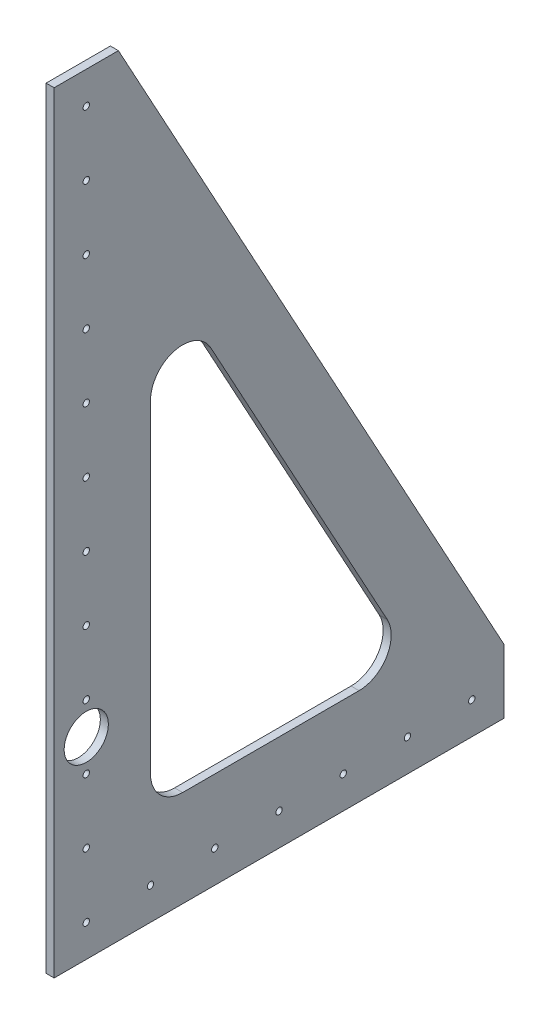
ISO-10303-21;
HEADER;
FILE_DESCRIPTION(('STEP AP214'),'2;1');
FILE_NAME('part.step','',(''),(''),'','','');
FILE_SCHEMA(('AUTOMOTIVE_DESIGN { 1 0 10303 214 1 1 1 1 }'));
ENDSEC;
DATA;
#1=APPLICATION_CONTEXT('core data for automotive mechanical design processes');
#2=APPLICATION_PROTOCOL_DEFINITION('international standard','automotive_design',2000,#1);
#3=PRODUCT_CONTEXT('',#1,'mechanical');
#4=PRODUCT('Part','Part','',(#3));
#5=PRODUCT_RELATED_PRODUCT_CATEGORY('part','',(#4));
#6=PRODUCT_DEFINITION_FORMATION('','',#4);
#7=PRODUCT_DEFINITION_CONTEXT('part definition',#1,'design');
#8=PRODUCT_DEFINITION('design','',#6,#7);
#9=PRODUCT_DEFINITION_SHAPE('','',#8);
#10=(LENGTH_UNIT() NAMED_UNIT(*) SI_UNIT(.MILLI.,.METRE.));
#11=(NAMED_UNIT(*) PLANE_ANGLE_UNIT() SI_UNIT($,.RADIAN.));
#12=(NAMED_UNIT(*) SI_UNIT($,.STERADIAN.) SOLID_ANGLE_UNIT());
#13=UNCERTAINTY_MEASURE_WITH_UNIT(LENGTH_MEASURE(1.E-05),#10,'distance_accuracy_value','');
#14=(GEOMETRIC_REPRESENTATION_CONTEXT(3) GLOBAL_UNCERTAINTY_ASSIGNED_CONTEXT((#13)) GLOBAL_UNIT_ASSIGNED_CONTEXT((#10,
#11,#12)) REPRESENTATION_CONTEXT('',''));
#15=CARTESIAN_POINT('',(0.,0.,0.));
#16=DIRECTION('',(0.,0.,1.));
#17=DIRECTION('',(1.,0.,0.));
#18=AXIS2_PLACEMENT_3D('',#15,#16,#17);
#19=CARTESIAN_POINT('',(6.35,0.,0.));
#20=DIRECTION('',(-1.,0.,0.));
#21=DIRECTION('',(0.,0.,1.));
#22=AXIS2_PLACEMENT_3D('',#19,#20,#21);
#23=PLANE('',#22);
#24=CARTESIAN_POINT('',(6.35,584.2,-25.4));
#25=DIRECTION('',(1.,0.,0.));
#26=DIRECTION('',(0.,0.,-1.));
#27=AXIS2_PLACEMENT_3D('',#24,#25,#26);
#28=CIRCLE('',#27,2.53999999999999);
#29=CARTESIAN_POINT('',(6.35,584.2,-27.94));
#30=VERTEX_POINT('',#29);
#31=EDGE_CURVE('E572',#30,#30,#28,.T.);
#32=ORIENTED_EDGE('',*,*,#31,.F.);
#33=EDGE_LOOP('',(#32));
#34=FACE_BOUND('',#33,.T.);
#35=CARTESIAN_POINT('',(6.35,533.4,-25.4));
#36=DIRECTION('',(1.,0.,0.));
#37=DIRECTION('',(0.,0.,-1.));
#38=AXIS2_PLACEMENT_3D('',#35,#36,#37);
#39=CIRCLE('',#38,2.53999999999999);
#40=CARTESIAN_POINT('',(6.35,533.4,-27.94));
#41=VERTEX_POINT('',#40);
#42=EDGE_CURVE('E576',#41,#41,#39,.T.);
#43=ORIENTED_EDGE('',*,*,#42,.F.);
#44=EDGE_LOOP('',(#43));
#45=FACE_BOUND('',#44,.T.);
#46=CARTESIAN_POINT('',(6.35,482.6,-25.4));
#47=DIRECTION('',(1.,0.,0.));
#48=DIRECTION('',(0.,0.,-1.));
#49=AXIS2_PLACEMENT_3D('',#46,#47,#48);
#50=CIRCLE('',#49,2.54);
#51=CARTESIAN_POINT('',(6.35,482.6,-27.94));
#52=VERTEX_POINT('',#51);
#53=EDGE_CURVE('E687',#52,#52,#50,.T.);
#54=ORIENTED_EDGE('',*,*,#53,.F.);
#55=EDGE_LOOP('',(#54));
#56=FACE_BOUND('',#55,.T.);
#57=CARTESIAN_POINT('',(6.35,431.8,-25.4));
#58=DIRECTION('',(1.,0.,0.));
#59=DIRECTION('',(0.,0.,-1.));
#60=AXIS2_PLACEMENT_3D('',#57,#58,#59);
#61=CIRCLE('',#60,2.54);
#62=CARTESIAN_POINT('',(6.35,431.8,-27.94));
#63=VERTEX_POINT('',#62);
#64=EDGE_CURVE('E679',#63,#63,#61,.T.);
#65=ORIENTED_EDGE('',*,*,#64,.F.);
#66=EDGE_LOOP('',(#65));
#67=FACE_BOUND('',#66,.T.);
#68=CARTESIAN_POINT('',(6.35,381.,-25.4));
#69=DIRECTION('',(1.,0.,0.));
#70=DIRECTION('',(0.,0.,-1.));
#71=AXIS2_PLACEMENT_3D('',#68,#69,#70);
#72=CIRCLE('',#71,2.54);
#73=CARTESIAN_POINT('',(6.35,381.,-27.94));
#74=VERTEX_POINT('',#73);
#75=EDGE_CURVE('E671',#74,#74,#72,.T.);
#76=ORIENTED_EDGE('',*,*,#75,.F.);
#77=EDGE_LOOP('',(#76));
#78=FACE_BOUND('',#77,.T.);
#79=CARTESIAN_POINT('',(6.35,330.2,-25.4));
#80=DIRECTION('',(1.,0.,0.));
#81=DIRECTION('',(0.,0.,-1.));
#82=AXIS2_PLACEMENT_3D('',#79,#80,#81);
#83=CIRCLE('',#82,2.54);
#84=CARTESIAN_POINT('',(6.35,330.2,-27.94));
#85=VERTEX_POINT('',#84);
#86=EDGE_CURVE('E663',#85,#85,#83,.T.);
#87=ORIENTED_EDGE('',*,*,#86,.F.);
#88=EDGE_LOOP('',(#87));
#89=FACE_BOUND('',#88,.T.);
#90=CARTESIAN_POINT('',(6.35,279.4,-25.4));
#91=DIRECTION('',(1.,0.,0.));
#92=DIRECTION('',(0.,0.,-1.));
#93=AXIS2_PLACEMENT_3D('',#90,#91,#92);
#94=CIRCLE('',#93,2.54);
#95=CARTESIAN_POINT('',(6.35,279.4,-27.94));
#96=VERTEX_POINT('',#95);
#97=EDGE_CURVE('E655',#96,#96,#94,.T.);
#98=ORIENTED_EDGE('',*,*,#97,.F.);
#99=EDGE_LOOP('',(#98));
#100=FACE_BOUND('',#99,.T.);
#101=CARTESIAN_POINT('',(6.35,228.6,-25.4));
#102=DIRECTION('',(1.,0.,0.));
#103=DIRECTION('',(0.,0.,-1.));
#104=AXIS2_PLACEMENT_3D('',#101,#102,#103);
#105=CIRCLE('',#104,2.54);
#106=CARTESIAN_POINT('',(6.35,228.6,-27.94));
#107=VERTEX_POINT('',#106);
#108=EDGE_CURVE('E647',#107,#107,#105,.T.);
#109=ORIENTED_EDGE('',*,*,#108,.F.);
#110=EDGE_LOOP('',(#109));
#111=FACE_BOUND('',#110,.T.);
#112=CARTESIAN_POINT('',(6.35,177.8,-25.4));
#113=DIRECTION('',(1.,0.,0.));
#114=DIRECTION('',(0.,0.,-1.));
#115=AXIS2_PLACEMENT_3D('',#112,#113,#114);
#116=CIRCLE('',#115,2.54);
#117=CARTESIAN_POINT('',(6.35,177.8,-27.94));
#118=VERTEX_POINT('',#117);
#119=EDGE_CURVE('E639',#118,#118,#116,.T.);
#120=ORIENTED_EDGE('',*,*,#119,.F.);
#121=EDGE_LOOP('',(#120));
#122=FACE_BOUND('',#121,.T.);
#123=CARTESIAN_POINT('',(6.35,127.,-25.4));
#124=DIRECTION('',(1.,0.,0.));
#125=DIRECTION('',(0.,0.,-1.));
#126=AXIS2_PLACEMENT_3D('',#123,#124,#125);
#127=CIRCLE('',#126,2.54);
#128=CARTESIAN_POINT('',(6.35,127.,-27.94));
#129=VERTEX_POINT('',#128);
#130=EDGE_CURVE('E631',#129,#129,#127,.T.);
#131=ORIENTED_EDGE('',*,*,#130,.F.);
#132=EDGE_LOOP('',(#131));
#133=FACE_BOUND('',#132,.T.);
#134=CARTESIAN_POINT('',(6.35,25.4,-25.4));
#135=DIRECTION('',(1.,0.,0.));
#136=DIRECTION('',(0.,0.,-1.));
#137=AXIS2_PLACEMENT_3D('',#134,#135,#136);
#138=CIRCLE('',#137,2.54);
#139=CARTESIAN_POINT('',(6.35,25.4,-27.94));
#140=VERTEX_POINT('',#139);
#141=EDGE_CURVE('E590',#140,#140,#138,.T.);
#142=ORIENTED_EDGE('',*,*,#141,.F.);
#143=EDGE_LOOP('',(#142));
#144=FACE_BOUND('',#143,.T.);
#145=CARTESIAN_POINT('',(6.35,25.4,-76.2));
#146=DIRECTION('',(1.,0.,0.));
#147=DIRECTION('',(0.,0.,-1.));
#148=AXIS2_PLACEMENT_3D('',#145,#146,#147);
#149=CIRCLE('',#148,2.54000000000001);
#150=CARTESIAN_POINT('',(6.35,25.4,-78.74));
#151=VERTEX_POINT('',#150);
#152=EDGE_CURVE('E605',#151,#151,#149,.T.);
#153=ORIENTED_EDGE('',*,*,#152,.F.);
#154=EDGE_LOOP('',(#153));
#155=FACE_BOUND('',#154,.T.);
#156=CARTESIAN_POINT('',(6.35,25.4,-127.));
#157=DIRECTION('',(1.,0.,0.));
#158=DIRECTION('',(0.,0.,-1.));
#159=AXIS2_PLACEMENT_3D('',#156,#157,#158);
#160=CIRCLE('',#159,2.54000000000001);
#161=CARTESIAN_POINT('',(6.35,25.4,-129.54));
#162=VERTEX_POINT('',#161);
#163=EDGE_CURVE('E613',#162,#162,#160,.T.);
#164=ORIENTED_EDGE('',*,*,#163,.F.);
#165=EDGE_LOOP('',(#164));
#166=FACE_BOUND('',#165,.T.);
#167=CARTESIAN_POINT('',(6.35,25.4,-177.8));
#168=DIRECTION('',(1.,0.,0.));
#169=DIRECTION('',(0.,0.,-1.));
#170=AXIS2_PLACEMENT_3D('',#167,#168,#169);
#171=CIRCLE('',#170,2.53999999999998);
#172=CARTESIAN_POINT('',(6.35,25.4,-180.34));
#173=VERTEX_POINT('',#172);
#174=EDGE_CURVE('E621',#173,#173,#171,.T.);
#175=ORIENTED_EDGE('',*,*,#174,.F.);
#176=EDGE_LOOP('',(#175));
#177=FACE_BOUND('',#176,.T.);
#178=CARTESIAN_POINT('',(6.35,76.2,-25.4));
#179=DIRECTION('',(1.,0.,0.));
#180=DIRECTION('',(0.,0.,-1.));
#181=AXIS2_PLACEMENT_3D('',#178,#179,#180);
#182=CIRCLE('',#181,2.54);
#183=CARTESIAN_POINT('',(6.35,76.2,-27.94));
#184=VERTEX_POINT('',#183);
#185=EDGE_CURVE('E630',#184,#184,#182,.T.);
#186=ORIENTED_EDGE('',*,*,#185,.F.);
#187=EDGE_LOOP('',(#186));
#188=FACE_BOUND('',#187,.T.);
#189=CARTESIAN_POINT('',(6.35,25.4,-330.2));
#190=DIRECTION('',(1.,0.,0.));
#191=DIRECTION('',(0.,0.,-1.));
#192=AXIS2_PLACEMENT_3D('',#189,#190,#191);
#193=CIRCLE('',#192,2.54000000000001);
#194=CARTESIAN_POINT('',(6.35,25.4,-332.74));
#195=VERTEX_POINT('',#194);
#196=EDGE_CURVE('E729',#195,#195,#193,.T.);
#197=ORIENTED_EDGE('',*,*,#196,.F.);
#198=EDGE_LOOP('',(#197));
#199=FACE_BOUND('',#198,.T.);
#200=CARTESIAN_POINT('',(6.35,25.4,-279.4));
#201=DIRECTION('',(1.,0.,0.));
#202=DIRECTION('',(0.,0.,-1.));
#203=AXIS2_PLACEMENT_3D('',#200,#201,#202);
#204=CIRCLE('',#203,2.54000000000001);
#205=CARTESIAN_POINT('',(6.35,25.4,-281.94));
#206=VERTEX_POINT('',#205);
#207=EDGE_CURVE('E599',#206,#206,#204,.T.);
#208=ORIENTED_EDGE('',*,*,#207,.F.);
#209=EDGE_LOOP('',(#208));
#210=FACE_BOUND('',#209,.T.);
#211=CARTESIAN_POINT('',(6.35,25.4,-228.6));
#212=DIRECTION('',(1.,0.,0.));
#213=DIRECTION('',(0.,0.,-1.));
#214=AXIS2_PLACEMENT_3D('',#211,#212,#213);
#215=CIRCLE('',#214,2.53999999999998);
#216=CARTESIAN_POINT('',(6.35,25.4,-231.14));
#217=VERTEX_POINT('',#216);
#218=EDGE_CURVE('E736',#217,#217,#215,.T.);
#219=ORIENTED_EDGE('',*,*,#218,.F.);
#220=EDGE_LOOP('',(#219));
#221=FACE_BOUND('',#220,.T.);
#222=CARTESIAN_POINT('',(6.35,152.4,-25.4));
#223=DIRECTION('',(1.,0.,0.));
#224=DIRECTION('',(0.,0.,-1.));
#225=AXIS2_PLACEMENT_3D('',#222,#223,#224);
#226=CIRCLE('',#225,17.4625);
#227=CARTESIAN_POINT('',(6.35,152.4,-42.8625));
#228=VERTEX_POINT('',#227);
#229=EDGE_CURVE('E582',#228,#228,#226,.T.);
#230=ORIENTED_EDGE('',*,*,#229,.F.);
#231=EDGE_LOOP('',(#230));
#232=FACE_BOUND('',#231,.T.);
#233=DIRECTION('',(0.,0.,-1.));
#234=VECTOR('',#233,1.);
#235=CARTESIAN_POINT('',(6.35,0.,-355.6));
#236=LINE('',#235,#234);
#237=CARTESIAN_POINT('',(6.35,0.,0.));
#238=VERTEX_POINT('',#237);
#239=CARTESIAN_POINT('',(6.35,0.,-355.6));
#240=VERTEX_POINT('',#239);
#241=EDGE_CURVE('E194',#238,#240,#236,.T.);
#242=ORIENTED_EDGE('',*,*,#241,.T.);
#243=DIRECTION('',(0.,1.,0.));
#244=VECTOR('',#243,1.);
#245=CARTESIAN_POINT('',(6.35,50.8,-355.6));
#246=LINE('',#245,#244);
#247=CARTESIAN_POINT('',(6.35,50.8,-355.6));
#248=VERTEX_POINT('',#247);
#249=EDGE_CURVE('E198',#240,#248,#246,.T.);
#250=ORIENTED_EDGE('',*,*,#249,.T.);
#251=DIRECTION('',(0.,0.877895572914384,0.478852130680573));
#252=VECTOR('',#251,1.);
#253=CARTESIAN_POINT('',(6.35,609.6,-50.8));
#254=LINE('',#253,#252);
#255=CARTESIAN_POINT('',(6.35,609.6,-50.8));
#256=VERTEX_POINT('',#255);
#257=EDGE_CURVE('E202',#248,#256,#254,.T.);
#258=ORIENTED_EDGE('',*,*,#257,.T.);
#259=DIRECTION('',(0.,0.,1.));
#260=VECTOR('',#259,1.);
#261=CARTESIAN_POINT('',(6.35,609.6,0.));
#262=LINE('',#261,#260);
#263=CARTESIAN_POINT('',(6.35,609.6,0.));
#264=VERTEX_POINT('',#263);
#265=EDGE_CURVE('E205',#256,#264,#262,.T.);
#266=ORIENTED_EDGE('',*,*,#265,.T.);
#267=DIRECTION('',(0.,-1.,0.));
#268=VECTOR('',#267,1.);
#269=CARTESIAN_POINT('',(6.35,0.,0.));
#270=LINE('',#269,#268);
#271=EDGE_CURVE('E208',#264,#238,#270,.T.);
#272=ORIENTED_EDGE('',*,*,#271,.T.);
#273=EDGE_LOOP('',(#242,#250,#258,#266,#272));
#274=FACE_BOUND('',#273,.T.);
#275=CARTESIAN_POINT('',(6.35,101.6,-241.092430603273));
#276=DIRECTION('',(1.,0.,0.));
#277=DIRECTION('',(0.,0.,1.));
#278=AXIS2_PLACEMENT_3D('',#275,#276,#277);
#279=CIRCLE('',#278,25.4);
#280=CARTESIAN_POINT('',(6.35,76.2,-241.092430603273));
#281=VERTEX_POINT('',#280);
#282=CARTESIAN_POINT('',(6.35,113.762844119287,-263.390978155298));
#283=VERTEX_POINT('',#282);
#284=EDGE_CURVE('E123',#281,#283,#279,.T.);
#285=ORIENTED_EDGE('',*,*,#284,.F.);
#286=DIRECTION('',(0.,0.,-1.));
#287=VECTOR('',#286,1.);
#288=CARTESIAN_POINT('',(6.35,76.2,-241.092430603273));
#289=LINE('',#288,#287);
#290=CARTESIAN_POINT('',(6.35,76.1999999999999,-101.6));
#291=VERTEX_POINT('',#290);
#292=EDGE_CURVE('E159',#291,#281,#289,.T.);
#293=ORIENTED_EDGE('',*,*,#292,.F.);
#294=CARTESIAN_POINT('',(6.35,101.6,-101.6));
#295=DIRECTION('',(1.,0.,0.));
#296=DIRECTION('',(0.,0.,1.));
#297=AXIS2_PLACEMENT_3D('',#294,#295,#296);
#298=CIRCLE('',#297,25.4);
#299=CARTESIAN_POINT('',(6.35,101.6,-76.2));
#300=VERTEX_POINT('',#299);
#301=EDGE_CURVE('E156',#300,#291,#298,.T.);
#302=ORIENTED_EDGE('',*,*,#301,.F.);
#303=DIRECTION('',(0.,-1.,0.));
#304=VECTOR('',#303,1.);
#305=CARTESIAN_POINT('',(6.35,101.6,-76.2));
#306=LINE('',#305,#304);
#307=CARTESIAN_POINT('',(6.35,357.336122772666,-76.2));
#308=VERTEX_POINT('',#307);
#309=EDGE_CURVE('E150',#308,#300,#306,.T.);
#310=ORIENTED_EDGE('',*,*,#309,.F.);
#311=CARTESIAN_POINT('',(6.35,357.336122772668,-101.6));
#312=DIRECTION('',(1.,0.,0.));
#313=DIRECTION('',(0.,0.,-1.));
#314=AXIS2_PLACEMENT_3D('',#311,#312,#313);
#315=CIRCLE('',#314,25.4);
#316=CARTESIAN_POINT('',(6.35,369.498966891953,-123.898547552026));
#317=VERTEX_POINT('',#316);
#318=EDGE_CURVE('E146',#317,#308,#315,.T.);
#319=ORIENTED_EDGE('',*,*,#318,.F.);
#320=DIRECTION('',(0.,0.877895572914385,0.478852130680573));
#321=VECTOR('',#320,1.);
#322=CARTESIAN_POINT('',(6.35,369.498966891953,-123.898547552026));
#323=LINE('',#322,#321);
#324=EDGE_CURVE('E132',#283,#317,#323,.T.);
#325=ORIENTED_EDGE('',*,*,#324,.F.);
#326=EDGE_LOOP('',(#285,#293,#302,#310,#319,#325));
#327=FACE_BOUND('',#326,.T.);
#328=ADVANCED_FACE('F39',(#34,#45,#56,#67,#78,#89,#100,#111,#122,#133,#144,#155,#166,#177,#188,
#199,#210,#221,#232,#274,#327),#23,.F.);
#329=CARTESIAN_POINT('',(0.,0.,0.));
#330=DIRECTION('',(-1.,0.,0.));
#331=DIRECTION('',(0.,0.,1.));
#332=AXIS2_PLACEMENT_3D('',#329,#330,#331);
#333=PLANE('',#332);
#334=CARTESIAN_POINT('',(0.,584.2,-25.4));
#335=DIRECTION('',(1.,0.,0.));
#336=DIRECTION('',(0.,0.,-1.));
#337=AXIS2_PLACEMENT_3D('',#334,#335,#336);
#338=CIRCLE('',#337,2.53999999999999);
#339=CARTESIAN_POINT('',(0.,584.2,-27.94));
#340=VERTEX_POINT('',#339);
#341=EDGE_CURVE('E570',#340,#340,#338,.T.);
#342=ORIENTED_EDGE('',*,*,#341,.T.);
#343=EDGE_LOOP('',(#342));
#344=FACE_BOUND('',#343,.T.);
#345=CARTESIAN_POINT('',(0.,533.4,-25.4));
#346=DIRECTION('',(1.,0.,0.));
#347=DIRECTION('',(0.,0.,-1.));
#348=AXIS2_PLACEMENT_3D('',#345,#346,#347);
#349=CIRCLE('',#348,2.53999999999999);
#350=CARTESIAN_POINT('',(0.,533.4,-27.94));
#351=VERTEX_POINT('',#350);
#352=EDGE_CURVE('E691',#351,#351,#349,.T.);
#353=ORIENTED_EDGE('',*,*,#352,.T.);
#354=EDGE_LOOP('',(#353));
#355=FACE_BOUND('',#354,.T.);
#356=CARTESIAN_POINT('',(0.,482.6,-25.4));
#357=DIRECTION('',(1.,0.,0.));
#358=DIRECTION('',(0.,0.,-1.));
#359=AXIS2_PLACEMENT_3D('',#356,#357,#358);
#360=CIRCLE('',#359,2.54);
#361=CARTESIAN_POINT('',(0.,482.6,-27.94));
#362=VERTEX_POINT('',#361);
#363=EDGE_CURVE('E683',#362,#362,#360,.T.);
#364=ORIENTED_EDGE('',*,*,#363,.T.);
#365=EDGE_LOOP('',(#364));
#366=FACE_BOUND('',#365,.T.);
#367=CARTESIAN_POINT('',(0.,431.8,-25.4));
#368=DIRECTION('',(1.,0.,0.));
#369=DIRECTION('',(0.,0.,-1.));
#370=AXIS2_PLACEMENT_3D('',#367,#368,#369);
#371=CIRCLE('',#370,2.54);
#372=CARTESIAN_POINT('',(0.,431.8,-27.94));
#373=VERTEX_POINT('',#372);
#374=EDGE_CURVE('E675',#373,#373,#371,.T.);
#375=ORIENTED_EDGE('',*,*,#374,.T.);
#376=EDGE_LOOP('',(#375));
#377=FACE_BOUND('',#376,.T.);
#378=CARTESIAN_POINT('',(0.,381.,-25.4));
#379=DIRECTION('',(1.,0.,0.));
#380=DIRECTION('',(0.,0.,-1.));
#381=AXIS2_PLACEMENT_3D('',#378,#379,#380);
#382=CIRCLE('',#381,2.54);
#383=CARTESIAN_POINT('',(0.,381.,-27.94));
#384=VERTEX_POINT('',#383);
#385=EDGE_CURVE('E667',#384,#384,#382,.T.);
#386=ORIENTED_EDGE('',*,*,#385,.T.);
#387=EDGE_LOOP('',(#386));
#388=FACE_BOUND('',#387,.T.);
#389=CARTESIAN_POINT('',(0.,330.2,-25.4));
#390=DIRECTION('',(1.,0.,0.));
#391=DIRECTION('',(0.,0.,-1.));
#392=AXIS2_PLACEMENT_3D('',#389,#390,#391);
#393=CIRCLE('',#392,2.54);
#394=CARTESIAN_POINT('',(0.,330.2,-27.94));
#395=VERTEX_POINT('',#394);
#396=EDGE_CURVE('E659',#395,#395,#393,.T.);
#397=ORIENTED_EDGE('',*,*,#396,.T.);
#398=EDGE_LOOP('',(#397));
#399=FACE_BOUND('',#398,.T.);
#400=CARTESIAN_POINT('',(0.,279.4,-25.4));
#401=DIRECTION('',(1.,0.,0.));
#402=DIRECTION('',(0.,0.,-1.));
#403=AXIS2_PLACEMENT_3D('',#400,#401,#402);
#404=CIRCLE('',#403,2.54);
#405=CARTESIAN_POINT('',(0.,279.4,-27.94));
#406=VERTEX_POINT('',#405);
#407=EDGE_CURVE('E651',#406,#406,#404,.T.);
#408=ORIENTED_EDGE('',*,*,#407,.T.);
#409=EDGE_LOOP('',(#408));
#410=FACE_BOUND('',#409,.T.);
#411=CARTESIAN_POINT('',(0.,228.6,-25.4));
#412=DIRECTION('',(1.,0.,0.));
#413=DIRECTION('',(0.,0.,-1.));
#414=AXIS2_PLACEMENT_3D('',#411,#412,#413);
#415=CIRCLE('',#414,2.54);
#416=CARTESIAN_POINT('',(0.,228.6,-27.94));
#417=VERTEX_POINT('',#416);
#418=EDGE_CURVE('E643',#417,#417,#415,.T.);
#419=ORIENTED_EDGE('',*,*,#418,.T.);
#420=EDGE_LOOP('',(#419));
#421=FACE_BOUND('',#420,.T.);
#422=CARTESIAN_POINT('',(0.,177.8,-25.4));
#423=DIRECTION('',(1.,0.,0.));
#424=DIRECTION('',(0.,0.,-1.));
#425=AXIS2_PLACEMENT_3D('',#422,#423,#424);
#426=CIRCLE('',#425,2.54);
#427=CARTESIAN_POINT('',(0.,177.8,-27.94));
#428=VERTEX_POINT('',#427);
#429=EDGE_CURVE('E635',#428,#428,#426,.T.);
#430=ORIENTED_EDGE('',*,*,#429,.T.);
#431=EDGE_LOOP('',(#430));
#432=FACE_BOUND('',#431,.T.);
#433=CARTESIAN_POINT('',(0.,127.,-25.4));
#434=DIRECTION('',(1.,0.,0.));
#435=DIRECTION('',(0.,0.,-1.));
#436=AXIS2_PLACEMENT_3D('',#433,#434,#435);
#437=CIRCLE('',#436,2.54);
#438=CARTESIAN_POINT('',(0.,127.,-27.94));
#439=VERTEX_POINT('',#438);
#440=EDGE_CURVE('E626',#439,#439,#437,.T.);
#441=ORIENTED_EDGE('',*,*,#440,.T.);
#442=EDGE_LOOP('',(#441));
#443=FACE_BOUND('',#442,.T.);
#444=CARTESIAN_POINT('',(0.,25.4,-25.4));
#445=DIRECTION('',(1.,0.,0.));
#446=DIRECTION('',(0.,0.,-1.));
#447=AXIS2_PLACEMENT_3D('',#444,#445,#446);
#448=CIRCLE('',#447,2.54);
#449=CARTESIAN_POINT('',(0.,25.4,-27.94));
#450=VERTEX_POINT('',#449);
#451=EDGE_CURVE('E585',#450,#450,#448,.T.);
#452=ORIENTED_EDGE('',*,*,#451,.T.);
#453=EDGE_LOOP('',(#452));
#454=FACE_BOUND('',#453,.T.);
#455=CARTESIAN_POINT('',(0.,25.4,-76.2));
#456=DIRECTION('',(1.,0.,0.));
#457=DIRECTION('',(0.,0.,-1.));
#458=AXIS2_PLACEMENT_3D('',#455,#456,#457);
#459=CIRCLE('',#458,2.54000000000001);
#460=CARTESIAN_POINT('',(0.,25.4,-78.74));
#461=VERTEX_POINT('',#460);
#462=EDGE_CURVE('E596',#461,#461,#459,.T.);
#463=ORIENTED_EDGE('',*,*,#462,.T.);
#464=EDGE_LOOP('',(#463));
#465=FACE_BOUND('',#464,.T.);
#466=CARTESIAN_POINT('',(0.,25.4,-127.));
#467=DIRECTION('',(1.,0.,0.));
#468=DIRECTION('',(0.,0.,-1.));
#469=AXIS2_PLACEMENT_3D('',#466,#467,#468);
#470=CIRCLE('',#469,2.54000000000001);
#471=CARTESIAN_POINT('',(0.,25.4,-129.54));
#472=VERTEX_POINT('',#471);
#473=EDGE_CURVE('E609',#472,#472,#470,.T.);
#474=ORIENTED_EDGE('',*,*,#473,.T.);
#475=EDGE_LOOP('',(#474));
#476=FACE_BOUND('',#475,.T.);
#477=CARTESIAN_POINT('',(0.,25.4,-177.8));
#478=DIRECTION('',(1.,0.,0.));
#479=DIRECTION('',(0.,0.,-1.));
#480=AXIS2_PLACEMENT_3D('',#477,#478,#479);
#481=CIRCLE('',#480,2.53999999999998);
#482=CARTESIAN_POINT('',(0.,25.4,-180.34));
#483=VERTEX_POINT('',#482);
#484=EDGE_CURVE('E617',#483,#483,#481,.T.);
#485=ORIENTED_EDGE('',*,*,#484,.T.);
#486=EDGE_LOOP('',(#485));
#487=FACE_BOUND('',#486,.T.);
#488=CARTESIAN_POINT('',(0.,76.2,-25.4));
#489=DIRECTION('',(1.,0.,0.));
#490=DIRECTION('',(0.,0.,-1.));
#491=AXIS2_PLACEMENT_3D('',#488,#489,#490);
#492=CIRCLE('',#491,2.54);
#493=CARTESIAN_POINT('',(0.,76.2,-27.94));
#494=VERTEX_POINT('',#493);
#495=EDGE_CURVE('E749',#494,#494,#492,.T.);
#496=ORIENTED_EDGE('',*,*,#495,.T.);
#497=EDGE_LOOP('',(#496));
#498=FACE_BOUND('',#497,.T.);
#499=CARTESIAN_POINT('',(0.,25.4,-330.2));
#500=DIRECTION('',(1.,0.,0.));
#501=DIRECTION('',(0.,0.,-1.));
#502=AXIS2_PLACEMENT_3D('',#499,#500,#501);
#503=CIRCLE('',#502,2.54000000000001);
#504=CARTESIAN_POINT('',(0.,25.4,-332.74));
#505=VERTEX_POINT('',#504);
#506=EDGE_CURVE('E755',#505,#505,#503,.T.);
#507=ORIENTED_EDGE('',*,*,#506,.T.);
#508=EDGE_LOOP('',(#507));
#509=FACE_BOUND('',#508,.T.);
#510=CARTESIAN_POINT('',(0.,25.4,-279.4));
#511=DIRECTION('',(1.,0.,0.));
#512=DIRECTION('',(0.,0.,-1.));
#513=AXIS2_PLACEMENT_3D('',#510,#511,#512);
#514=CIRCLE('',#513,2.54000000000001);
#515=CARTESIAN_POINT('',(0.,25.4,-281.94));
#516=VERTEX_POINT('',#515);
#517=EDGE_CURVE('E739',#516,#516,#514,.T.);
#518=ORIENTED_EDGE('',*,*,#517,.T.);
#519=EDGE_LOOP('',(#518));
#520=FACE_BOUND('',#519,.T.);
#521=CARTESIAN_POINT('',(0.,25.4,-228.6));
#522=DIRECTION('',(1.,0.,0.));
#523=DIRECTION('',(0.,0.,-1.));
#524=AXIS2_PLACEMENT_3D('',#521,#522,#523);
#525=CIRCLE('',#524,2.53999999999998);
#526=CARTESIAN_POINT('',(0.,25.4,-231.14));
#527=VERTEX_POINT('',#526);
#528=EDGE_CURVE('E625',#527,#527,#525,.T.);
#529=ORIENTED_EDGE('',*,*,#528,.T.);
#530=EDGE_LOOP('',(#529));
#531=FACE_BOUND('',#530,.T.);
#532=CARTESIAN_POINT('',(0.,152.4,-25.4));
#533=DIRECTION('',(1.,0.,0.));
#534=DIRECTION('',(0.,0.,-1.));
#535=AXIS2_PLACEMENT_3D('',#532,#533,#534);
#536=CIRCLE('',#535,17.4625);
#537=CARTESIAN_POINT('',(0.,152.4,-42.8625));
#538=VERTEX_POINT('',#537);
#539=EDGE_CURVE('E164',#538,#538,#536,.T.);
#540=ORIENTED_EDGE('',*,*,#539,.T.);
#541=EDGE_LOOP('',(#540));
#542=FACE_BOUND('',#541,.T.);
#543=DIRECTION('',(0.,0.,-1.));
#544=VECTOR('',#543,1.);
#545=CARTESIAN_POINT('',(0.,0.,-355.6));
#546=LINE('',#545,#544);
#547=CARTESIAN_POINT('',(0.,0.,0.));
#548=VERTEX_POINT('',#547);
#549=CARTESIAN_POINT('',(0.,0.,-355.6));
#550=VERTEX_POINT('',#549);
#551=EDGE_CURVE('E141',#548,#550,#546,.T.);
#552=ORIENTED_EDGE('',*,*,#551,.F.);
#553=DIRECTION('',(0.,-1.,0.));
#554=VECTOR('',#553,1.);
#555=CARTESIAN_POINT('',(0.,0.,0.));
#556=LINE('',#555,#554);
#557=CARTESIAN_POINT('',(0.,609.6,0.));
#558=VERTEX_POINT('',#557);
#559=EDGE_CURVE('E199',#558,#548,#556,.T.);
#560=ORIENTED_EDGE('',*,*,#559,.F.);
#561=DIRECTION('',(0.,0.,1.));
#562=VECTOR('',#561,1.);
#563=CARTESIAN_POINT('',(0.,609.6,0.));
#564=LINE('',#563,#562);
#565=CARTESIAN_POINT('',(0.,609.6,-50.8));
#566=VERTEX_POINT('',#565);
#567=EDGE_CURVE('E221',#566,#558,#564,.T.);
#568=ORIENTED_EDGE('',*,*,#567,.F.);
#569=DIRECTION('',(0.,0.877895572914384,0.478852130680573));
#570=VECTOR('',#569,1.);
#571=CARTESIAN_POINT('',(0.,609.6,-50.8));
#572=LINE('',#571,#570);
#573=CARTESIAN_POINT('',(0.,50.8,-355.6));
#574=VERTEX_POINT('',#573);
#575=EDGE_CURVE('E218',#574,#566,#572,.T.);
#576=ORIENTED_EDGE('',*,*,#575,.F.);
#577=DIRECTION('',(0.,1.,0.));
#578=VECTOR('',#577,1.);
#579=CARTESIAN_POINT('',(0.,50.8,-355.6));
#580=LINE('',#579,#578);
#581=EDGE_CURVE('E215',#550,#574,#580,.T.);
#582=ORIENTED_EDGE('',*,*,#581,.F.);
#583=EDGE_LOOP('',(#552,#560,#568,#576,#582));
#584=FACE_BOUND('',#583,.T.);
#585=DIRECTION('',(0.,0.,-1.));
#586=VECTOR('',#585,1.);
#587=CARTESIAN_POINT('',(0.,76.2,-241.092430603273));
#588=LINE('',#587,#586);
#589=CARTESIAN_POINT('',(0.,76.1999999999999,-101.6));
#590=VERTEX_POINT('',#589);
#591=CARTESIAN_POINT('',(0.,76.2,-241.092430603273));
#592=VERTEX_POINT('',#591);
#593=EDGE_CURVE('E133',#590,#592,#588,.T.);
#594=ORIENTED_EDGE('',*,*,#593,.T.);
#595=CARTESIAN_POINT('',(0.,101.6,-241.092430603273));
#596=DIRECTION('',(1.,0.,0.));
#597=DIRECTION('',(0.,0.,1.));
#598=AXIS2_PLACEMENT_3D('',#595,#596,#597);
#599=CIRCLE('',#598,25.4);
#600=CARTESIAN_POINT('',(0.,113.762844119287,-263.390978155298));
#601=VERTEX_POINT('',#600);
#602=EDGE_CURVE('E63',#592,#601,#599,.T.);
#603=ORIENTED_EDGE('',*,*,#602,.T.);
#604=DIRECTION('',(0.,0.877895572914385,0.478852130680573));
#605=VECTOR('',#604,1.);
#606=CARTESIAN_POINT('',(0.,369.498966891953,-123.898547552026));
#607=LINE('',#606,#605);
#608=CARTESIAN_POINT('',(0.,369.498966891953,-123.898547552026));
#609=VERTEX_POINT('',#608);
#610=EDGE_CURVE('E139',#601,#609,#607,.T.);
#611=ORIENTED_EDGE('',*,*,#610,.T.);
#612=CARTESIAN_POINT('',(0.,357.336122772668,-101.6));
#613=DIRECTION('',(1.,0.,0.));
#614=DIRECTION('',(0.,0.,-1.));
#615=AXIS2_PLACEMENT_3D('',#612,#613,#614);
#616=CIRCLE('',#615,25.4);
#617=CARTESIAN_POINT('',(0.,357.336122772666,-76.2));
#618=VERTEX_POINT('',#617);
#619=EDGE_CURVE('E167',#609,#618,#616,.T.);
#620=ORIENTED_EDGE('',*,*,#619,.T.);
#621=DIRECTION('',(0.,-1.,0.));
#622=VECTOR('',#621,1.);
#623=CARTESIAN_POINT('',(0.,101.6,-76.2));
#624=LINE('',#623,#622);
#625=CARTESIAN_POINT('',(0.,101.6,-76.2));
#626=VERTEX_POINT('',#625);
#627=EDGE_CURVE('E171',#618,#626,#624,.T.);
#628=ORIENTED_EDGE('',*,*,#627,.T.);
#629=CARTESIAN_POINT('',(0.,101.6,-101.6));
#630=DIRECTION('',(1.,0.,0.));
#631=DIRECTION('',(0.,0.,1.));
#632=AXIS2_PLACEMENT_3D('',#629,#630,#631);
#633=CIRCLE('',#632,25.4);
#634=EDGE_CURVE('E175',#626,#590,#633,.T.);
#635=ORIENTED_EDGE('',*,*,#634,.T.);
#636=EDGE_LOOP('',(#594,#603,#611,#620,#628,#635));
#637=FACE_BOUND('',#636,.T.);
#638=ADVANCED_FACE('F248',(#344,#355,#366,#377,#388,#399,#410,#421,#432,#443,#454,#465,#476,
#487,#498,#509,#520,#531,#542,#584,#637),#333,.T.);
#639=CARTESIAN_POINT('',(6.35,0.,-355.6));
#640=DIRECTION('',(0.,1.,0.));
#641=DIRECTION('',(0.,0.,1.));
#642=AXIS2_PLACEMENT_3D('',#639,#640,#641);
#643=PLANE('',#642);
#644=ORIENTED_EDGE('',*,*,#551,.T.);
#645=DIRECTION('',(-1.,0.,0.));
#646=VECTOR('',#645,1.);
#647=CARTESIAN_POINT('',(6.35,0.,-355.6));
#648=LINE('',#647,#646);
#649=EDGE_CURVE('E11',#240,#550,#648,.T.);
#650=ORIENTED_EDGE('',*,*,#649,.F.);
#651=ORIENTED_EDGE('',*,*,#241,.F.);
#652=DIRECTION('',(-1.,0.,0.));
#653=VECTOR('',#652,1.);
#654=CARTESIAN_POINT('',(6.35,0.,0.));
#655=LINE('',#654,#653);
#656=EDGE_CURVE('E211',#238,#548,#655,.T.);
#657=ORIENTED_EDGE('',*,*,#656,.T.);
#658=EDGE_LOOP('',(#644,#650,#651,#657));
#659=FACE_BOUND('',#658,.T.);
#660=ADVANCED_FACE('F41',(#659),#643,.F.);
#661=CARTESIAN_POINT('',(6.35,50.8,-355.6));
#662=DIRECTION('',(0.,0.,1.));
#663=DIRECTION('',(1.,0.,0.));
#664=AXIS2_PLACEMENT_3D('',#661,#662,#663);
#665=PLANE('',#664);
#666=ORIENTED_EDGE('',*,*,#581,.T.);
#667=DIRECTION('',(-1.,0.,0.));
#668=VECTOR('',#667,1.);
#669=CARTESIAN_POINT('',(6.35,50.8,-355.6));
#670=LINE('',#669,#668);
#671=EDGE_CURVE('E48',#248,#574,#670,.T.);
#672=ORIENTED_EDGE('',*,*,#671,.F.);
#673=ORIENTED_EDGE('',*,*,#249,.F.);
#674=ORIENTED_EDGE('',*,*,#649,.T.);
#675=EDGE_LOOP('',(#666,#672,#673,#674));
#676=FACE_BOUND('',#675,.T.);
#677=ADVANCED_FACE('F262',(#676),#665,.F.);
#678=CARTESIAN_POINT('',(6.35,609.6,-50.8));
#679=DIRECTION('',(0.,-0.478852130680573,0.877895572914384));
#680=DIRECTION('',(0.,-0.877895572914384,-0.478852130680573));
#681=AXIS2_PLACEMENT_3D('',#678,#679,#680);
#682=PLANE('',#681);
#683=ORIENTED_EDGE('',*,*,#575,.T.);
#684=DIRECTION('',(-1.,0.,0.));
#685=VECTOR('',#684,1.);
#686=CARTESIAN_POINT('',(6.35,609.6,-50.8));
#687=LINE('',#686,#685);
#688=EDGE_CURVE('E233',#256,#566,#687,.T.);
#689=ORIENTED_EDGE('',*,*,#688,.F.);
#690=ORIENTED_EDGE('',*,*,#257,.F.);
#691=ORIENTED_EDGE('',*,*,#671,.T.);
#692=EDGE_LOOP('',(#683,#689,#690,#691));
#693=FACE_BOUND('',#692,.T.);
#694=ADVANCED_FACE('F242',(#693),#682,.F.);
#695=CARTESIAN_POINT('',(6.35,609.6,0.));
#696=DIRECTION('',(0.,-1.,0.));
#697=DIRECTION('',(0.,0.,-1.));
#698=AXIS2_PLACEMENT_3D('',#695,#696,#697);
#699=PLANE('',#698);
#700=ORIENTED_EDGE('',*,*,#567,.T.);
#701=DIRECTION('',(-1.,0.,0.));
#702=VECTOR('',#701,1.);
#703=CARTESIAN_POINT('',(6.35,609.6,0.));
#704=LINE('',#703,#702);
#705=EDGE_CURVE('E229',#264,#558,#704,.T.);
#706=ORIENTED_EDGE('',*,*,#705,.F.);
#707=ORIENTED_EDGE('',*,*,#265,.F.);
#708=ORIENTED_EDGE('',*,*,#688,.T.);
#709=EDGE_LOOP('',(#700,#706,#707,#708));
#710=FACE_BOUND('',#709,.T.);
#711=ADVANCED_FACE('F253',(#710),#699,.F.);
#712=CARTESIAN_POINT('',(6.35,0.,0.));
#713=DIRECTION('',(0.,0.,-1.));
#714=DIRECTION('',(-1.,0.,0.));
#715=AXIS2_PLACEMENT_3D('',#712,#713,#714);
#716=PLANE('',#715);
#717=ORIENTED_EDGE('',*,*,#559,.T.);
#718=ORIENTED_EDGE('',*,*,#656,.F.);
#719=ORIENTED_EDGE('',*,*,#271,.F.);
#720=ORIENTED_EDGE('',*,*,#705,.T.);
#721=EDGE_LOOP('',(#717,#718,#719,#720));
#722=FACE_BOUND('',#721,.T.);
#723=ADVANCED_FACE('F257',(#722),#716,.F.);
#724=CARTESIAN_POINT('',(6.35,101.6,-241.092430603273));
#725=DIRECTION('',(-1.,0.,0.));
#726=DIRECTION('',(0.,0.,1.));
#727=AXIS2_PLACEMENT_3D('',#724,#725,#726);
#728=CYLINDRICAL_SURFACE('',#727,25.4);
#729=ORIENTED_EDGE('',*,*,#602,.F.);
#730=DIRECTION('',(-1.,0.,0.));
#731=VECTOR('',#730,1.);
#732=CARTESIAN_POINT('',(6.35,76.2,-241.092430603273));
#733=LINE('',#732,#731);
#734=EDGE_CURVE('E127',#281,#592,#733,.T.);
#735=ORIENTED_EDGE('',*,*,#734,.F.);
#736=ORIENTED_EDGE('',*,*,#284,.T.);
#737=DIRECTION('',(-1.,0.,0.));
#738=VECTOR('',#737,1.);
#739=CARTESIAN_POINT('',(6.35,113.762844119287,-263.390978155298));
#740=LINE('',#739,#738);
#741=EDGE_CURVE('E126',#283,#601,#740,.T.);
#742=ORIENTED_EDGE('',*,*,#741,.T.);
#743=EDGE_LOOP('',(#729,#735,#736,#742));
#744=FACE_BOUND('',#743,.T.);
#745=ADVANCED_FACE('F125',(#744),#728,.F.);
#746=CARTESIAN_POINT('',(6.35,369.498966891953,-123.898547552026));
#747=DIRECTION('',(0.,-0.478852130680573,0.877895572914384));
#748=DIRECTION('',(0.,-0.877895572914384,-0.478852130680573));
#749=AXIS2_PLACEMENT_3D('',#746,#747,#748);
#750=PLANE('',#749);
#751=ORIENTED_EDGE('',*,*,#610,.F.);
#752=ORIENTED_EDGE('',*,*,#741,.F.);
#753=ORIENTED_EDGE('',*,*,#324,.T.);
#754=DIRECTION('',(-1.,0.,0.));
#755=VECTOR('',#754,1.);
#756=CARTESIAN_POINT('',(6.35,369.498966891953,-123.898547552026));
#757=LINE('',#756,#755);
#758=EDGE_CURVE('E142',#317,#609,#757,.T.);
#759=ORIENTED_EDGE('',*,*,#758,.T.);
#760=EDGE_LOOP('',(#751,#752,#753,#759));
#761=FACE_BOUND('',#760,.T.);
#762=ADVANCED_FACE('F136',(#761),#750,.T.);
#763=CARTESIAN_POINT('',(6.35,357.336122772668,-101.6));
#764=DIRECTION('',(-1.,0.,0.));
#765=DIRECTION('',(0.,0.,1.));
#766=AXIS2_PLACEMENT_3D('',#763,#764,#765);
#767=CYLINDRICAL_SURFACE('',#766,25.4);
#768=ORIENTED_EDGE('',*,*,#619,.F.);
#769=ORIENTED_EDGE('',*,*,#758,.F.);
#770=ORIENTED_EDGE('',*,*,#318,.T.);
#771=DIRECTION('',(-1.,0.,0.));
#772=VECTOR('',#771,1.);
#773=CARTESIAN_POINT('',(6.35,357.336122772666,-76.2));
#774=LINE('',#773,#772);
#775=EDGE_CURVE('E189',#308,#618,#774,.T.);
#776=ORIENTED_EDGE('',*,*,#775,.T.);
#777=EDGE_LOOP('',(#768,#769,#770,#776));
#778=FACE_BOUND('',#777,.T.);
#779=ADVANCED_FACE('F309',(#778),#767,.F.);
#780=CARTESIAN_POINT('',(6.35,101.6,-76.2));
#781=DIRECTION('',(0.,0.,-1.));
#782=DIRECTION('',(0.,1.,0.));
#783=AXIS2_PLACEMENT_3D('',#780,#781,#782);
#784=PLANE('',#783);
#785=ORIENTED_EDGE('',*,*,#627,.F.);
#786=ORIENTED_EDGE('',*,*,#775,.F.);
#787=ORIENTED_EDGE('',*,*,#309,.T.);
#788=DIRECTION('',(-1.,0.,0.));
#789=VECTOR('',#788,1.);
#790=CARTESIAN_POINT('',(6.35,101.6,-76.2));
#791=LINE('',#790,#789);
#792=EDGE_CURVE('E186',#300,#626,#791,.T.);
#793=ORIENTED_EDGE('',*,*,#792,.T.);
#794=EDGE_LOOP('',(#785,#786,#787,#793));
#795=FACE_BOUND('',#794,.T.);
#796=ADVANCED_FACE('F315',(#795),#784,.T.);
#797=CARTESIAN_POINT('',(6.35,101.6,-101.6));
#798=DIRECTION('',(-1.,0.,0.));
#799=DIRECTION('',(0.,0.,1.));
#800=AXIS2_PLACEMENT_3D('',#797,#798,#799);
#801=CYLINDRICAL_SURFACE('',#800,25.4);
#802=ORIENTED_EDGE('',*,*,#634,.F.);
#803=ORIENTED_EDGE('',*,*,#792,.F.);
#804=ORIENTED_EDGE('',*,*,#301,.T.);
#805=DIRECTION('',(-1.,0.,0.));
#806=VECTOR('',#805,1.);
#807=CARTESIAN_POINT('',(6.35,76.1999999999999,-101.6));
#808=LINE('',#807,#806);
#809=EDGE_CURVE('E55',#291,#590,#808,.T.);
#810=ORIENTED_EDGE('',*,*,#809,.T.);
#811=EDGE_LOOP('',(#802,#803,#804,#810));
#812=FACE_BOUND('',#811,.T.);
#813=ADVANCED_FACE('F323',(#812),#801,.F.);
#814=CARTESIAN_POINT('',(6.35,76.2,-241.092430603273));
#815=DIRECTION('',(0.,1.,0.));
#816=DIRECTION('',(0.,0.,1.));
#817=AXIS2_PLACEMENT_3D('',#814,#815,#816);
#818=PLANE('',#817);
#819=ORIENTED_EDGE('',*,*,#593,.F.);
#820=ORIENTED_EDGE('',*,*,#809,.F.);
#821=ORIENTED_EDGE('',*,*,#292,.T.);
#822=ORIENTED_EDGE('',*,*,#734,.T.);
#823=EDGE_LOOP('',(#819,#820,#821,#822));
#824=FACE_BOUND('',#823,.T.);
#825=ADVANCED_FACE('F331',(#824),#818,.T.);
#826=CARTESIAN_POINT('',(0.,152.4,-25.4));
#827=DIRECTION('',(1.,0.,0.));
#828=DIRECTION('',(0.,0.,-1.));
#829=AXIS2_PLACEMENT_3D('',#826,#827,#828);
#830=CYLINDRICAL_SURFACE('',#829,17.4625);
#831=ORIENTED_EDGE('',*,*,#539,.F.);
#832=EDGE_LOOP('',(#831));
#833=FACE_BOUND('',#832,.T.);
#834=ORIENTED_EDGE('',*,*,#229,.T.);
#835=EDGE_LOOP('',(#834));
#836=FACE_BOUND('',#835,.T.);
#837=ADVANCED_FACE('F339',(#833,#836),#830,.F.);
#838=CARTESIAN_POINT('',(0.,25.4,-228.6));
#839=DIRECTION('',(1.,0.,0.));
#840=DIRECTION('',(0.,0.,-1.));
#841=AXIS2_PLACEMENT_3D('',#838,#839,#840);
#842=CYLINDRICAL_SURFACE('',#841,2.53999999999998);
#843=ORIENTED_EDGE('',*,*,#528,.F.);
#844=EDGE_LOOP('',(#843));
#845=FACE_BOUND('',#844,.T.);
#846=ORIENTED_EDGE('',*,*,#218,.T.);
#847=EDGE_LOOP('',(#846));
#848=FACE_BOUND('',#847,.T.);
#849=ADVANCED_FACE('F346',(#845,#848),#842,.F.);
#850=CARTESIAN_POINT('',(0.,25.4,-279.4));
#851=DIRECTION('',(1.,0.,0.));
#852=DIRECTION('',(0.,0.,-1.));
#853=AXIS2_PLACEMENT_3D('',#850,#851,#852);
#854=CYLINDRICAL_SURFACE('',#853,2.54000000000001);
#855=ORIENTED_EDGE('',*,*,#517,.F.);
#856=EDGE_LOOP('',(#855));
#857=FACE_BOUND('',#856,.T.);
#858=ORIENTED_EDGE('',*,*,#207,.T.);
#859=EDGE_LOOP('',(#858));
#860=FACE_BOUND('',#859,.T.);
#861=ADVANCED_FACE('F355',(#857,#860),#854,.F.);
#862=CARTESIAN_POINT('',(0.,25.4,-330.2));
#863=DIRECTION('',(1.,0.,0.));
#864=DIRECTION('',(0.,0.,-1.));
#865=AXIS2_PLACEMENT_3D('',#862,#863,#864);
#866=CYLINDRICAL_SURFACE('',#865,2.54000000000001);
#867=ORIENTED_EDGE('',*,*,#506,.F.);
#868=EDGE_LOOP('',(#867));
#869=FACE_BOUND('',#868,.T.);
#870=ORIENTED_EDGE('',*,*,#196,.T.);
#871=EDGE_LOOP('',(#870));
#872=FACE_BOUND('',#871,.T.);
#873=ADVANCED_FACE('F363',(#869,#872),#866,.F.);
#874=CARTESIAN_POINT('',(0.,76.2,-25.4));
#875=DIRECTION('',(1.,0.,0.));
#876=DIRECTION('',(0.,0.,-1.));
#877=AXIS2_PLACEMENT_3D('',#874,#875,#876);
#878=CYLINDRICAL_SURFACE('',#877,2.54);
#879=ORIENTED_EDGE('',*,*,#495,.F.);
#880=EDGE_LOOP('',(#879));
#881=FACE_BOUND('',#880,.T.);
#882=ORIENTED_EDGE('',*,*,#185,.T.);
#883=EDGE_LOOP('',(#882));
#884=FACE_BOUND('',#883,.T.);
#885=ADVANCED_FACE('F371',(#881,#884),#878,.F.);
#886=CARTESIAN_POINT('',(0.,25.4,-177.8));
#887=DIRECTION('',(1.,0.,0.));
#888=DIRECTION('',(0.,0.,-1.));
#889=AXIS2_PLACEMENT_3D('',#886,#887,#888);
#890=CYLINDRICAL_SURFACE('',#889,2.53999999999998);
#891=ORIENTED_EDGE('',*,*,#484,.F.);
#892=EDGE_LOOP('',(#891));
#893=FACE_BOUND('',#892,.T.);
#894=ORIENTED_EDGE('',*,*,#174,.T.);
#895=EDGE_LOOP('',(#894));
#896=FACE_BOUND('',#895,.T.);
#897=ADVANCED_FACE('F379',(#893,#896),#890,.F.);
#898=CARTESIAN_POINT('',(0.,25.4,-127.));
#899=DIRECTION('',(1.,0.,0.));
#900=DIRECTION('',(0.,0.,-1.));
#901=AXIS2_PLACEMENT_3D('',#898,#899,#900);
#902=CYLINDRICAL_SURFACE('',#901,2.54000000000001);
#903=ORIENTED_EDGE('',*,*,#473,.F.);
#904=EDGE_LOOP('',(#903));
#905=FACE_BOUND('',#904,.T.);
#906=ORIENTED_EDGE('',*,*,#163,.T.);
#907=EDGE_LOOP('',(#906));
#908=FACE_BOUND('',#907,.T.);
#909=ADVANCED_FACE('F387',(#905,#908),#902,.F.);
#910=CARTESIAN_POINT('',(0.,25.4,-76.2));
#911=DIRECTION('',(1.,0.,0.));
#912=DIRECTION('',(0.,0.,-1.));
#913=AXIS2_PLACEMENT_3D('',#910,#911,#912);
#914=CYLINDRICAL_SURFACE('',#913,2.54000000000001);
#915=ORIENTED_EDGE('',*,*,#462,.F.);
#916=EDGE_LOOP('',(#915));
#917=FACE_BOUND('',#916,.T.);
#918=ORIENTED_EDGE('',*,*,#152,.T.);
#919=EDGE_LOOP('',(#918));
#920=FACE_BOUND('',#919,.T.);
#921=ADVANCED_FACE('F395',(#917,#920),#914,.F.);
#922=CARTESIAN_POINT('',(0.,25.4,-25.4));
#923=DIRECTION('',(1.,0.,0.));
#924=DIRECTION('',(0.,0.,-1.));
#925=AXIS2_PLACEMENT_3D('',#922,#923,#924);
#926=CYLINDRICAL_SURFACE('',#925,2.54);
#927=ORIENTED_EDGE('',*,*,#451,.F.);
#928=EDGE_LOOP('',(#927));
#929=FACE_BOUND('',#928,.T.);
#930=ORIENTED_EDGE('',*,*,#141,.T.);
#931=EDGE_LOOP('',(#930));
#932=FACE_BOUND('',#931,.T.);
#933=ADVANCED_FACE('F403',(#929,#932),#926,.F.);
#934=CARTESIAN_POINT('',(0.,127.,-25.4));
#935=DIRECTION('',(1.,0.,0.));
#936=DIRECTION('',(0.,0.,-1.));
#937=AXIS2_PLACEMENT_3D('',#934,#935,#936);
#938=CYLINDRICAL_SURFACE('',#937,2.54);
#939=ORIENTED_EDGE('',*,*,#440,.F.);
#940=EDGE_LOOP('',(#939));
#941=FACE_BOUND('',#940,.T.);
#942=ORIENTED_EDGE('',*,*,#130,.T.);
#943=EDGE_LOOP('',(#942));
#944=FACE_BOUND('',#943,.T.);
#945=ADVANCED_FACE('F411',(#941,#944),#938,.F.);
#946=CARTESIAN_POINT('',(0.,177.8,-25.4));
#947=DIRECTION('',(1.,0.,0.));
#948=DIRECTION('',(0.,0.,-1.));
#949=AXIS2_PLACEMENT_3D('',#946,#947,#948);
#950=CYLINDRICAL_SURFACE('',#949,2.54);
#951=ORIENTED_EDGE('',*,*,#429,.F.);
#952=EDGE_LOOP('',(#951));
#953=FACE_BOUND('',#952,.T.);
#954=ORIENTED_EDGE('',*,*,#119,.T.);
#955=EDGE_LOOP('',(#954));
#956=FACE_BOUND('',#955,.T.);
#957=ADVANCED_FACE('F419',(#953,#956),#950,.F.);
#958=CARTESIAN_POINT('',(0.,228.6,-25.4));
#959=DIRECTION('',(1.,0.,0.));
#960=DIRECTION('',(0.,0.,-1.));
#961=AXIS2_PLACEMENT_3D('',#958,#959,#960);
#962=CYLINDRICAL_SURFACE('',#961,2.54);
#963=ORIENTED_EDGE('',*,*,#418,.F.);
#964=EDGE_LOOP('',(#963));
#965=FACE_BOUND('',#964,.T.);
#966=ORIENTED_EDGE('',*,*,#108,.T.);
#967=EDGE_LOOP('',(#966));
#968=FACE_BOUND('',#967,.T.);
#969=ADVANCED_FACE('F427',(#965,#968),#962,.F.);
#970=CARTESIAN_POINT('',(0.,279.4,-25.4));
#971=DIRECTION('',(1.,0.,0.));
#972=DIRECTION('',(0.,0.,-1.));
#973=AXIS2_PLACEMENT_3D('',#970,#971,#972);
#974=CYLINDRICAL_SURFACE('',#973,2.54);
#975=ORIENTED_EDGE('',*,*,#407,.F.);
#976=EDGE_LOOP('',(#975));
#977=FACE_BOUND('',#976,.T.);
#978=ORIENTED_EDGE('',*,*,#97,.T.);
#979=EDGE_LOOP('',(#978));
#980=FACE_BOUND('',#979,.T.);
#981=ADVANCED_FACE('F435',(#977,#980),#974,.F.);
#982=CARTESIAN_POINT('',(0.,330.2,-25.4));
#983=DIRECTION('',(1.,0.,0.));
#984=DIRECTION('',(0.,0.,-1.));
#985=AXIS2_PLACEMENT_3D('',#982,#983,#984);
#986=CYLINDRICAL_SURFACE('',#985,2.54);
#987=ORIENTED_EDGE('',*,*,#396,.F.);
#988=EDGE_LOOP('',(#987));
#989=FACE_BOUND('',#988,.T.);
#990=ORIENTED_EDGE('',*,*,#86,.T.);
#991=EDGE_LOOP('',(#990));
#992=FACE_BOUND('',#991,.T.);
#993=ADVANCED_FACE('F443',(#989,#992),#986,.F.);
#994=CARTESIAN_POINT('',(0.,381.,-25.4));
#995=DIRECTION('',(1.,0.,0.));
#996=DIRECTION('',(0.,0.,-1.));
#997=AXIS2_PLACEMENT_3D('',#994,#995,#996);
#998=CYLINDRICAL_SURFACE('',#997,2.54);
#999=ORIENTED_EDGE('',*,*,#385,.F.);
#1000=EDGE_LOOP('',(#999));
#1001=FACE_BOUND('',#1000,.T.);
#1002=ORIENTED_EDGE('',*,*,#75,.T.);
#1003=EDGE_LOOP('',(#1002));
#1004=FACE_BOUND('',#1003,.T.);
#1005=ADVANCED_FACE('F451',(#1001,#1004),#998,.F.);
#1006=CARTESIAN_POINT('',(0.,431.8,-25.4));
#1007=DIRECTION('',(1.,0.,0.));
#1008=DIRECTION('',(0.,0.,-1.));
#1009=AXIS2_PLACEMENT_3D('',#1006,#1007,#1008);
#1010=CYLINDRICAL_SURFACE('',#1009,2.54);
#1011=ORIENTED_EDGE('',*,*,#374,.F.);
#1012=EDGE_LOOP('',(#1011));
#1013=FACE_BOUND('',#1012,.T.);
#1014=ORIENTED_EDGE('',*,*,#64,.T.);
#1015=EDGE_LOOP('',(#1014));
#1016=FACE_BOUND('',#1015,.T.);
#1017=ADVANCED_FACE('F459',(#1013,#1016),#1010,.F.);
#1018=CARTESIAN_POINT('',(0.,482.6,-25.4));
#1019=DIRECTION('',(1.,0.,0.));
#1020=DIRECTION('',(0.,0.,-1.));
#1021=AXIS2_PLACEMENT_3D('',#1018,#1019,#1020);
#1022=CYLINDRICAL_SURFACE('',#1021,2.54);
#1023=ORIENTED_EDGE('',*,*,#363,.F.);
#1024=EDGE_LOOP('',(#1023));
#1025=FACE_BOUND('',#1024,.T.);
#1026=ORIENTED_EDGE('',*,*,#53,.T.);
#1027=EDGE_LOOP('',(#1026));
#1028=FACE_BOUND('',#1027,.T.);
#1029=ADVANCED_FACE('F467',(#1025,#1028),#1022,.F.);
#1030=CARTESIAN_POINT('',(0.,533.4,-25.4));
#1031=DIRECTION('',(1.,0.,0.));
#1032=DIRECTION('',(0.,0.,-1.));
#1033=AXIS2_PLACEMENT_3D('',#1030,#1031,#1032);
#1034=CYLINDRICAL_SURFACE('',#1033,2.53999999999999);
#1035=ORIENTED_EDGE('',*,*,#352,.F.);
#1036=EDGE_LOOP('',(#1035));
#1037=FACE_BOUND('',#1036,.T.);
#1038=ORIENTED_EDGE('',*,*,#42,.T.);
#1039=EDGE_LOOP('',(#1038));
#1040=FACE_BOUND('',#1039,.T.);
#1041=ADVANCED_FACE('F475',(#1037,#1040),#1034,.F.);
#1042=CARTESIAN_POINT('',(0.,584.2,-25.4));
#1043=DIRECTION('',(1.,0.,0.));
#1044=DIRECTION('',(0.,0.,-1.));
#1045=AXIS2_PLACEMENT_3D('',#1042,#1043,#1044);
#1046=CYLINDRICAL_SURFACE('',#1045,2.53999999999999);
#1047=ORIENTED_EDGE('',*,*,#341,.F.);
#1048=EDGE_LOOP('',(#1047));
#1049=FACE_BOUND('',#1048,.T.);
#1050=ORIENTED_EDGE('',*,*,#31,.T.);
#1051=EDGE_LOOP('',(#1050));
#1052=FACE_BOUND('',#1051,.T.);
#1053=ADVANCED_FACE('F483',(#1049,#1052),#1046,.F.);
#1054=CLOSED_SHELL('',(#328,#638,#660,#677,#694,#711,#723,#745,#762,#779,#796,#813,#825,#837,
#849,#861,#873,#885,#897,#909,#921,#933,#945,#957,#969,#981,#993,#1005,#1017,#1029,#1041,#1053));
#1055=MANIFOLD_SOLID_BREP('B2',#1054);
#1056=ADVANCED_BREP_SHAPE_REPRESENTATION('',(#18,#1055),#14);
#1057=SHAPE_DEFINITION_REPRESENTATION(#9,#1056);
ENDSEC;
END-ISO-10303-21;
